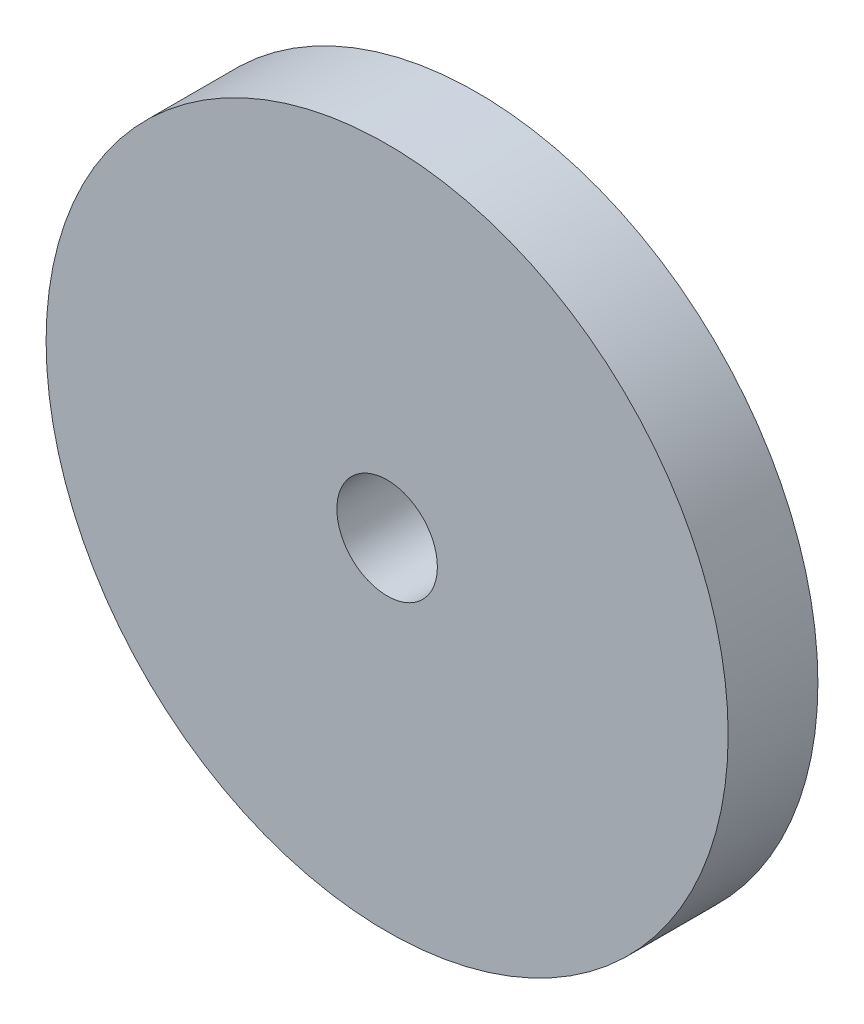
ISO-10303-21;
HEADER;
FILE_DESCRIPTION(('STEP AP214'),'2;1');
FILE_NAME('part.step','',(''),(''),'','','');
FILE_SCHEMA(('AUTOMOTIVE_DESIGN { 1 0 10303 214 1 1 1 1 }'));
ENDSEC;
DATA;
#1=APPLICATION_CONTEXT('core data for automotive mechanical design processes');
#2=APPLICATION_PROTOCOL_DEFINITION('international standard','automotive_design',2000,#1);
#3=PRODUCT_CONTEXT('',#1,'mechanical');
#4=PRODUCT('Part','Part','',(#3));
#5=PRODUCT_RELATED_PRODUCT_CATEGORY('part','',(#4));
#6=PRODUCT_DEFINITION_FORMATION('','',#4);
#7=PRODUCT_DEFINITION_CONTEXT('part definition',#1,'design');
#8=PRODUCT_DEFINITION('design','',#6,#7);
#9=PRODUCT_DEFINITION_SHAPE('','',#8);
#10=(LENGTH_UNIT() NAMED_UNIT(*) SI_UNIT(.MILLI.,.METRE.));
#11=(NAMED_UNIT(*) PLANE_ANGLE_UNIT() SI_UNIT($,.RADIAN.));
#12=(NAMED_UNIT(*) SI_UNIT($,.STERADIAN.) SOLID_ANGLE_UNIT());
#13=UNCERTAINTY_MEASURE_WITH_UNIT(LENGTH_MEASURE(1.E-05),#10,'distance_accuracy_value','');
#14=(GEOMETRIC_REPRESENTATION_CONTEXT(3) GLOBAL_UNCERTAINTY_ASSIGNED_CONTEXT((#13)) GLOBAL_UNIT_ASSIGNED_CONTEXT((#10,
#11,#12)) REPRESENTATION_CONTEXT('',''));
#15=CARTESIAN_POINT('',(0.,0.,0.));
#16=DIRECTION('',(0.,0.,1.));
#17=DIRECTION('',(1.,0.,0.));
#18=AXIS2_PLACEMENT_3D('',#15,#16,#17);
#19=CARTESIAN_POINT('',(0.,0.,2.5));
#20=DIRECTION('',(0.,0.,1.));
#21=DIRECTION('',(1.,0.,0.));
#22=AXIS2_PLACEMENT_3D('',#19,#20,#21);
#23=PLANE('',#22);
#24=CARTESIAN_POINT('',(0.,0.,2.5));
#25=DIRECTION('',(0.,0.,1.));
#26=DIRECTION('',(1.,0.,0.));
#27=AXIS2_PLACEMENT_3D('',#24,#25,#26);
#28=CIRCLE('',#27,19.);
#29=CARTESIAN_POINT('',(19.,0.,2.5));
#30=VERTEX_POINT('',#29);
#31=EDGE_CURVE('E10',#30,#30,#28,.T.);
#32=ORIENTED_EDGE('',*,*,#31,.T.);
#33=EDGE_LOOP('',(#32));
#34=FACE_BOUND('',#33,.T.);
#35=CARTESIAN_POINT('',(0.,0.,2.5));
#36=DIRECTION('',(0.,0.,1.));
#37=DIRECTION('',(1.,0.,0.));
#38=AXIS2_PLACEMENT_3D('',#35,#36,#37);
#39=CIRCLE('',#38,2.8);
#40=CARTESIAN_POINT('',(2.8,0.,2.5));
#41=VERTEX_POINT('',#40);
#42=EDGE_CURVE('E41',#41,#41,#39,.T.);
#43=ORIENTED_EDGE('',*,*,#42,.F.);
#44=EDGE_LOOP('',(#43));
#45=FACE_BOUND('',#44,.T.);
#46=ADVANCED_FACE('F30',(#34,#45),#23,.T.);
#47=CARTESIAN_POINT('',(0.,0.,-2.5));
#48=DIRECTION('',(0.,0.,1.));
#49=DIRECTION('',(1.,0.,0.));
#50=AXIS2_PLACEMENT_3D('',#47,#48,#49);
#51=PLANE('',#50);
#52=CARTESIAN_POINT('',(0.,0.,-2.5));
#53=DIRECTION('',(0.,0.,1.));
#54=DIRECTION('',(1.,0.,0.));
#55=AXIS2_PLACEMENT_3D('',#52,#53,#54);
#56=CIRCLE('',#55,19.);
#57=CARTESIAN_POINT('',(19.,0.,-2.5));
#58=VERTEX_POINT('',#57);
#59=EDGE_CURVE('E34',#58,#58,#56,.T.);
#60=ORIENTED_EDGE('',*,*,#59,.F.);
#61=EDGE_LOOP('',(#60));
#62=FACE_BOUND('',#61,.T.);
#63=CARTESIAN_POINT('',(0.,0.,-2.5));
#64=DIRECTION('',(0.,0.,1.));
#65=DIRECTION('',(1.,0.,0.));
#66=AXIS2_PLACEMENT_3D('',#63,#64,#65);
#67=CIRCLE('',#66,2.8);
#68=CARTESIAN_POINT('',(2.8,0.,-2.5));
#69=VERTEX_POINT('',#68);
#70=EDGE_CURVE('E43',#69,#69,#67,.T.);
#71=ORIENTED_EDGE('',*,*,#70,.T.);
#72=EDGE_LOOP('',(#71));
#73=FACE_BOUND('',#72,.T.);
#74=ADVANCED_FACE('F53',(#62,#73),#51,.F.);
#75=CARTESIAN_POINT('',(0.,0.,2.5));
#76=DIRECTION('',(0.,0.,-1.));
#77=DIRECTION('',(-1.,0.,0.));
#78=AXIS2_PLACEMENT_3D('',#75,#76,#77);
#79=CYLINDRICAL_SURFACE('',#78,19.);
#80=ORIENTED_EDGE('',*,*,#31,.F.);
#81=EDGE_LOOP('',(#80));
#82=FACE_BOUND('',#81,.T.);
#83=ORIENTED_EDGE('',*,*,#59,.T.);
#84=EDGE_LOOP('',(#83));
#85=FACE_BOUND('',#84,.T.);
#86=ADVANCED_FACE('F32',(#82,#85),#79,.T.);
#87=CARTESIAN_POINT('',(0.,0.,2.5));
#88=DIRECTION('',(0.,0.,-1.));
#89=DIRECTION('',(-1.,0.,0.));
#90=AXIS2_PLACEMENT_3D('',#87,#88,#89);
#91=CYLINDRICAL_SURFACE('',#90,2.8);
#92=ORIENTED_EDGE('',*,*,#42,.T.);
#93=EDGE_LOOP('',(#92));
#94=FACE_BOUND('',#93,.T.);
#95=ORIENTED_EDGE('',*,*,#70,.F.);
#96=EDGE_LOOP('',(#95));
#97=FACE_BOUND('',#96,.T.);
#98=ADVANCED_FACE('F49',(#94,#97),#91,.F.);
#99=CLOSED_SHELL('',(#46,#74,#86,#98));
#100=MANIFOLD_SOLID_BREP('B2',#99);
#101=ADVANCED_BREP_SHAPE_REPRESENTATION('',(#18,#100),#14);
#102=SHAPE_DEFINITION_REPRESENTATION(#9,#101);
ENDSEC;
END-ISO-10303-21;
